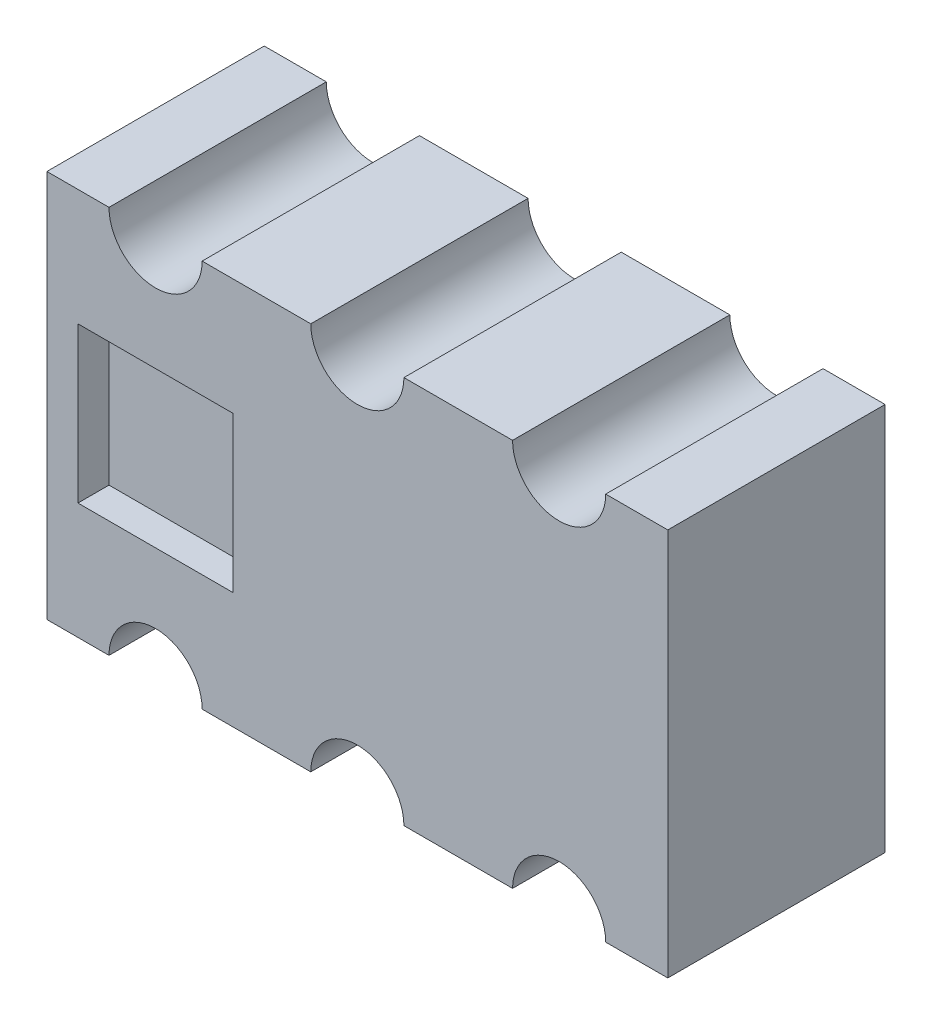
ISO-10303-21;
HEADER;
FILE_DESCRIPTION(('STEP AP214'),'2;1');
FILE_NAME('part.step','',(''),(''),'','','');
FILE_SCHEMA(('AUTOMOTIVE_DESIGN { 1 0 10303 214 1 1 1 1 }'));
ENDSEC;
DATA;
#1=APPLICATION_CONTEXT('core data for automotive mechanical design processes');
#2=APPLICATION_PROTOCOL_DEFINITION('international standard','automotive_design',2000,#1);
#3=PRODUCT_CONTEXT('',#1,'mechanical');
#4=PRODUCT('Part','Part','',(#3));
#5=PRODUCT_RELATED_PRODUCT_CATEGORY('part','',(#4));
#6=PRODUCT_DEFINITION_FORMATION('','',#4);
#7=PRODUCT_DEFINITION_CONTEXT('part definition',#1,'design');
#8=PRODUCT_DEFINITION('design','',#6,#7);
#9=PRODUCT_DEFINITION_SHAPE('','',#8);
#10=(LENGTH_UNIT() NAMED_UNIT(*) SI_UNIT(.MILLI.,.METRE.));
#11=(NAMED_UNIT(*) PLANE_ANGLE_UNIT() SI_UNIT($,.RADIAN.));
#12=(NAMED_UNIT(*) SI_UNIT($,.STERADIAN.) SOLID_ANGLE_UNIT());
#13=UNCERTAINTY_MEASURE_WITH_UNIT(LENGTH_MEASURE(1.E-05),#10,'distance_accuracy_value','');
#14=(GEOMETRIC_REPRESENTATION_CONTEXT(3) GLOBAL_UNCERTAINTY_ASSIGNED_CONTEXT((#13)) GLOBAL_UNIT_ASSIGNED_CONTEXT((#10,
#11,#12)) REPRESENTATION_CONTEXT('',''));
#15=CARTESIAN_POINT('',(0.,0.,0.));
#16=DIRECTION('',(0.,0.,1.));
#17=DIRECTION('',(1.,0.,0.));
#18=AXIS2_PLACEMENT_3D('',#15,#16,#17);
#19=CARTESIAN_POINT('',(-0.9,0.25,0.6));
#20=DIRECTION('',(0.,0.,-1.));
#21=DIRECTION('',(-1.,0.,0.));
#22=AXIS2_PLACEMENT_3D('',#19,#20,#21);
#23=PLANE('',#22);
#24=DIRECTION('',(1.,0.,0.));
#25=VECTOR('',#24,1.);
#26=CARTESIAN_POINT('',(-0.4,-0.25,0.6));
#27=LINE('',#26,#25);
#28=CARTESIAN_POINT('',(-0.4,-0.25,0.6));
#29=VERTEX_POINT('',#28);
#30=CARTESIAN_POINT('',(-0.9,-0.25,0.6));
#31=VERTEX_POINT('',#30);
#32=EDGE_CURVE('E148',#29,#31,#27,.F.);
#33=ORIENTED_EDGE('',*,*,#32,.F.);
#34=DIRECTION('',(0.,1.,0.));
#35=VECTOR('',#34,1.);
#36=CARTESIAN_POINT('',(-0.4,0.25,0.6));
#37=LINE('',#36,#35);
#38=CARTESIAN_POINT('',(-0.4,0.25,0.6));
#39=VERTEX_POINT('',#38);
#40=EDGE_CURVE('E288',#39,#29,#37,.F.);
#41=ORIENTED_EDGE('',*,*,#40,.F.);
#42=DIRECTION('',(1.,0.,0.));
#43=VECTOR('',#42,1.);
#44=CARTESIAN_POINT('',(-0.9,0.25,0.6));
#45=LINE('',#44,#43);
#46=CARTESIAN_POINT('',(-0.9,0.25,0.6));
#47=VERTEX_POINT('',#46);
#48=EDGE_CURVE('E164',#47,#39,#45,.T.);
#49=ORIENTED_EDGE('',*,*,#48,.F.);
#50=DIRECTION('',(0.,1.,0.));
#51=VECTOR('',#50,1.);
#52=CARTESIAN_POINT('',(-0.9,-0.25,0.6));
#53=LINE('',#52,#51);
#54=EDGE_CURVE('E141',#31,#47,#53,.T.);
#55=ORIENTED_EDGE('',*,*,#54,.F.);
#56=EDGE_LOOP('',(#33,#41,#49,#55));
#57=FACE_BOUND('',#56,.T.);
#58=ADVANCED_FACE('F17',(#57),#23,.F.);
#59=CARTESIAN_POINT('',(-0.4,-0.25,0.6));
#60=DIRECTION('',(0.,1.,0.));
#61=DIRECTION('',(0.,0.,1.));
#62=AXIS2_PLACEMENT_3D('',#59,#60,#61);
#63=PLANE('',#62);
#64=ORIENTED_EDGE('',*,*,#32,.T.);
#65=DIRECTION('',(0.,0.,-1.));
#66=VECTOR('',#65,1.);
#67=CARTESIAN_POINT('',(-0.9,-0.25,0.6));
#68=LINE('',#67,#66);
#69=CARTESIAN_POINT('',(-0.9,-0.25,0.7));
#70=VERTEX_POINT('',#69);
#71=EDGE_CURVE('E152',#70,#31,#68,.T.);
#72=ORIENTED_EDGE('',*,*,#71,.F.);
#73=DIRECTION('',(1.,0.,0.));
#74=VECTOR('',#73,1.);
#75=CARTESIAN_POINT('',(-1.,-0.25,0.7));
#76=LINE('',#75,#74);
#77=CARTESIAN_POINT('',(-0.4,-0.25,0.7));
#78=VERTEX_POINT('',#77);
#79=EDGE_CURVE('E252',#78,#70,#76,.F.);
#80=ORIENTED_EDGE('',*,*,#79,.F.);
#81=DIRECTION('',(0.,0.,1.));
#82=VECTOR('',#81,1.);
#83=CARTESIAN_POINT('',(-0.4,-0.25,0.6));
#84=LINE('',#83,#82);
#85=EDGE_CURVE('E155',#29,#78,#84,.T.);
#86=ORIENTED_EDGE('',*,*,#85,.F.);
#87=EDGE_LOOP('',(#64,#72,#80,#86));
#88=FACE_BOUND('',#87,.T.);
#89=ADVANCED_FACE('F149',(#88),#63,.T.);
#90=CARTESIAN_POINT('',(-0.9,-0.25,0.6));
#91=DIRECTION('',(1.,0.,0.));
#92=DIRECTION('',(0.,0.,-1.));
#93=AXIS2_PLACEMENT_3D('',#90,#91,#92);
#94=PLANE('',#93);
#95=ORIENTED_EDGE('',*,*,#54,.T.);
#96=DIRECTION('',(0.,0.,-1.));
#97=VECTOR('',#96,1.);
#98=CARTESIAN_POINT('',(-0.9,0.25,0.6));
#99=LINE('',#98,#97);
#100=CARTESIAN_POINT('',(-0.9,0.25,0.7));
#101=VERTEX_POINT('',#100);
#102=EDGE_CURVE('E165',#101,#47,#99,.T.);
#103=ORIENTED_EDGE('',*,*,#102,.F.);
#104=DIRECTION('',(0.,1.,0.));
#105=VECTOR('',#104,1.);
#106=CARTESIAN_POINT('',(-0.9,-0.625,0.7));
#107=LINE('',#106,#105);
#108=EDGE_CURVE('E161',#70,#101,#107,.T.);
#109=ORIENTED_EDGE('',*,*,#108,.F.);
#110=ORIENTED_EDGE('',*,*,#71,.T.);
#111=EDGE_LOOP('',(#95,#103,#109,#110));
#112=FACE_BOUND('',#111,.T.);
#113=ADVANCED_FACE('F159',(#112),#94,.T.);
#114=CARTESIAN_POINT('',(-0.9,0.25,0.6));
#115=DIRECTION('',(0.,-1.,0.));
#116=DIRECTION('',(0.,0.,-1.));
#117=AXIS2_PLACEMENT_3D('',#114,#115,#116);
#118=PLANE('',#117);
#119=ORIENTED_EDGE('',*,*,#48,.T.);
#120=DIRECTION('',(0.,0.,1.));
#121=VECTOR('',#120,1.);
#122=CARTESIAN_POINT('',(-0.4,0.25,0.6));
#123=LINE('',#122,#121);
#124=CARTESIAN_POINT('',(-0.4,0.25,0.7));
#125=VERTEX_POINT('',#124);
#126=EDGE_CURVE('E290',#125,#39,#123,.F.);
#127=ORIENTED_EDGE('',*,*,#126,.F.);
#128=DIRECTION('',(1.,0.,0.));
#129=VECTOR('',#128,1.);
#130=CARTESIAN_POINT('',(-1.,0.25,0.7));
#131=LINE('',#130,#129);
#132=EDGE_CURVE('E248',#101,#125,#131,.T.);
#133=ORIENTED_EDGE('',*,*,#132,.F.);
#134=ORIENTED_EDGE('',*,*,#102,.T.);
#135=EDGE_LOOP('',(#119,#127,#133,#134));
#136=FACE_BOUND('',#135,.T.);
#137=ADVANCED_FACE('F294',(#136),#118,.T.);
#138=CARTESIAN_POINT('',(-0.4,0.25,0.6));
#139=DIRECTION('',(-1.,0.,0.));
#140=DIRECTION('',(0.,0.,1.));
#141=AXIS2_PLACEMENT_3D('',#138,#139,#140);
#142=PLANE('',#141);
#143=ORIENTED_EDGE('',*,*,#40,.T.);
#144=ORIENTED_EDGE('',*,*,#85,.T.);
#145=DIRECTION('',(0.,1.,0.));
#146=VECTOR('',#145,1.);
#147=CARTESIAN_POINT('',(-0.4,-0.625,0.7));
#148=LINE('',#147,#146);
#149=EDGE_CURVE('E245',#125,#78,#148,.F.);
#150=ORIENTED_EDGE('',*,*,#149,.F.);
#151=ORIENTED_EDGE('',*,*,#126,.T.);
#152=EDGE_LOOP('',(#143,#144,#150,#151));
#153=FACE_BOUND('',#152,.T.);
#154=ADVANCED_FACE('F298',(#153),#142,.T.);
#155=CARTESIAN_POINT('',(-1.,-0.625,0.7));
#156=DIRECTION('',(0.,0.,1.));
#157=DIRECTION('',(1.,0.,0.));
#158=AXIS2_PLACEMENT_3D('',#155,#156,#157);
#159=PLANE('',#158);
#160=ORIENTED_EDGE('',*,*,#132,.T.);
#161=ORIENTED_EDGE('',*,*,#149,.T.);
#162=ORIENTED_EDGE('',*,*,#79,.T.);
#163=ORIENTED_EDGE('',*,*,#108,.T.);
#164=EDGE_LOOP('',(#160,#161,#162,#163));
#165=FACE_BOUND('',#164,.T.);
#166=DIRECTION('',(1.,0.,0.));
#167=VECTOR('',#166,1.);
#168=CARTESIAN_POINT('',(1.,0.625,0.7));
#169=LINE('',#168,#167);
#170=CARTESIAN_POINT('',(0.5,0.625,0.700000000000017));
#171=VERTEX_POINT('',#170);
#172=CARTESIAN_POINT('',(0.15,0.625,0.700000000000025));
#173=VERTEX_POINT('',#172);
#174=EDGE_CURVE('E202',#171,#173,#169,.F.);
#175=ORIENTED_EDGE('',*,*,#174,.T.);
#176=CARTESIAN_POINT('',(0.,0.625,0.700000000000034));
#177=DIRECTION('',(0.,0.,1.));
#178=DIRECTION('',(1.,0.,0.));
#179=AXIS2_PLACEMENT_3D('',#176,#177,#178);
#180=CIRCLE('',#179,0.15);
#181=CARTESIAN_POINT('',(-0.15,0.625,0.700000000000017));
#182=VERTEX_POINT('',#181);
#183=EDGE_CURVE('E195',#173,#182,#180,.F.);
#184=ORIENTED_EDGE('',*,*,#183,.T.);
#185=DIRECTION('',(1.,0.,0.));
#186=VECTOR('',#185,1.);
#187=CARTESIAN_POINT('',(1.,0.625,0.7));
#188=LINE('',#187,#186);
#189=CARTESIAN_POINT('',(-0.5,0.625,0.700000000000025));
#190=VERTEX_POINT('',#189);
#191=EDGE_CURVE('E255',#182,#190,#188,.F.);
#192=ORIENTED_EDGE('',*,*,#191,.T.);
#193=CARTESIAN_POINT('',(-0.65,0.625,0.700000000000034));
#194=DIRECTION('',(0.,0.,1.));
#195=DIRECTION('',(1.,0.,0.));
#196=AXIS2_PLACEMENT_3D('',#193,#194,#195);
#197=CIRCLE('',#196,0.15);
#198=CARTESIAN_POINT('',(-0.8,0.625,0.700000000000025));
#199=VERTEX_POINT('',#198);
#200=EDGE_CURVE('E191',#190,#199,#197,.F.);
#201=ORIENTED_EDGE('',*,*,#200,.T.);
#202=DIRECTION('',(1.,0.,0.));
#203=VECTOR('',#202,1.);
#204=CARTESIAN_POINT('',(1.,0.625,0.7));
#205=LINE('',#204,#203);
#206=CARTESIAN_POINT('',(-1.,0.625,0.7));
#207=VERTEX_POINT('',#206);
#208=EDGE_CURVE('E242',#199,#207,#205,.F.);
#209=ORIENTED_EDGE('',*,*,#208,.T.);
#210=DIRECTION('',(0.,1.,0.));
#211=VECTOR('',#210,1.);
#212=CARTESIAN_POINT('',(-1.,0.625,0.7));
#213=LINE('',#212,#211);
#214=CARTESIAN_POINT('',(-1.,-0.625,0.7));
#215=VERTEX_POINT('',#214);
#216=EDGE_CURVE('E121',#207,#215,#213,.F.);
#217=ORIENTED_EDGE('',*,*,#216,.T.);
#218=DIRECTION('',(1.,0.,0.));
#219=VECTOR('',#218,1.);
#220=CARTESIAN_POINT('',(-1.,-0.625,0.7));
#221=LINE('',#220,#219);
#222=CARTESIAN_POINT('',(-0.8,-0.625,0.700000000000025));
#223=VERTEX_POINT('',#222);
#224=EDGE_CURVE('E114',#215,#223,#221,.T.);
#225=ORIENTED_EDGE('',*,*,#224,.T.);
#226=CARTESIAN_POINT('',(-0.65,-0.625,0.700000000000034));
#227=DIRECTION('',(0.,0.,1.));
#228=DIRECTION('',(1.,0.,0.));
#229=AXIS2_PLACEMENT_3D('',#226,#227,#228);
#230=CIRCLE('',#229,0.15);
#231=CARTESIAN_POINT('',(-0.5,-0.625,0.700000000000017));
#232=VERTEX_POINT('',#231);
#233=EDGE_CURVE('E20',#223,#232,#230,.F.);
#234=ORIENTED_EDGE('',*,*,#233,.T.);
#235=DIRECTION('',(1.,0.,0.));
#236=VECTOR('',#235,1.);
#237=CARTESIAN_POINT('',(-1.,-0.625,0.7));
#238=LINE('',#237,#236);
#239=CARTESIAN_POINT('',(-0.15,-0.625,0.700000000000025));
#240=VERTEX_POINT('',#239);
#241=EDGE_CURVE('E222',#232,#240,#238,.T.);
#242=ORIENTED_EDGE('',*,*,#241,.T.);
#243=CARTESIAN_POINT('',(0.,-0.625,0.700000000000034));
#244=DIRECTION('',(0.,0.,1.));
#245=DIRECTION('',(1.,0.,0.));
#246=AXIS2_PLACEMENT_3D('',#243,#244,#245);
#247=CIRCLE('',#246,0.15);
#248=CARTESIAN_POINT('',(0.15,-0.625,0.700000000000017));
#249=VERTEX_POINT('',#248);
#250=EDGE_CURVE('E208',#240,#249,#247,.F.);
#251=ORIENTED_EDGE('',*,*,#250,.T.);
#252=DIRECTION('',(1.,0.,0.));
#253=VECTOR('',#252,1.);
#254=CARTESIAN_POINT('',(-1.,-0.625,0.7));
#255=LINE('',#254,#253);
#256=CARTESIAN_POINT('',(0.5,-0.625,0.700000000000025));
#257=VERTEX_POINT('',#256);
#258=EDGE_CURVE('E214',#249,#257,#255,.T.);
#259=ORIENTED_EDGE('',*,*,#258,.T.);
#260=CARTESIAN_POINT('',(0.65,-0.625,0.700000000000034));
#261=DIRECTION('',(0.,0.,1.));
#262=DIRECTION('',(1.,0.,0.));
#263=AXIS2_PLACEMENT_3D('',#260,#261,#262);
#264=CIRCLE('',#263,0.15);
#265=CARTESIAN_POINT('',(0.8,-0.625,0.700000000000017));
#266=VERTEX_POINT('',#265);
#267=EDGE_CURVE('E204',#257,#266,#264,.F.);
#268=ORIENTED_EDGE('',*,*,#267,.T.);
#269=DIRECTION('',(1.,0.,0.));
#270=VECTOR('',#269,1.);
#271=CARTESIAN_POINT('',(-1.,-0.625,0.7));
#272=LINE('',#271,#270);
#273=CARTESIAN_POINT('',(1.,-0.625,0.7));
#274=VERTEX_POINT('',#273);
#275=EDGE_CURVE('E206',#266,#274,#272,.T.);
#276=ORIENTED_EDGE('',*,*,#275,.T.);
#277=DIRECTION('',(0.,1.,0.));
#278=VECTOR('',#277,1.);
#279=CARTESIAN_POINT('',(1.,-0.625,0.7));
#280=LINE('',#279,#278);
#281=CARTESIAN_POINT('',(1.,0.625,0.7));
#282=VERTEX_POINT('',#281);
#283=EDGE_CURVE('E268',#274,#282,#280,.T.);
#284=ORIENTED_EDGE('',*,*,#283,.T.);
#285=DIRECTION('',(1.,0.,0.));
#286=VECTOR('',#285,1.);
#287=CARTESIAN_POINT('',(1.,0.625,0.7));
#288=LINE('',#287,#286);
#289=CARTESIAN_POINT('',(0.8,0.625,0.700000000000025));
#290=VERTEX_POINT('',#289);
#291=EDGE_CURVE('E263',#282,#290,#288,.F.);
#292=ORIENTED_EDGE('',*,*,#291,.T.);
#293=CARTESIAN_POINT('',(0.65,0.625,0.700000000000034));
#294=DIRECTION('',(0.,0.,1.));
#295=DIRECTION('',(1.,0.,0.));
#296=AXIS2_PLACEMENT_3D('',#293,#294,#295);
#297=CIRCLE('',#296,0.15);
#298=EDGE_CURVE('E199',#290,#171,#297,.F.);
#299=ORIENTED_EDGE('',*,*,#298,.T.);
#300=EDGE_LOOP('',(#175,#184,#192,#201,#209,#217,#225,#234,#242,#251,#259,#268,#276,#284,#292,#299));
#301=FACE_BOUND('',#300,.T.);
#302=ADVANCED_FACE('F302',(#165,#301),#159,.T.);
#303=CARTESIAN_POINT('',(1.,0.625,0.7));
#304=DIRECTION('',(0.,-1.,0.));
#305=DIRECTION('',(0.,0.,-1.));
#306=AXIS2_PLACEMENT_3D('',#303,#304,#305);
#307=PLANE('',#306);
#308=DIRECTION('',(1.,0.,0.));
#309=VECTOR('',#308,1.);
#310=CARTESIAN_POINT('',(-1.,0.625,0.));
#311=LINE('',#310,#309);
#312=CARTESIAN_POINT('',(-0.8,0.625,0.));
#313=VERTEX_POINT('',#312);
#314=CARTESIAN_POINT('',(-1.,0.625,0.));
#315=VERTEX_POINT('',#314);
#316=EDGE_CURVE('E194',#313,#315,#311,.F.);
#317=ORIENTED_EDGE('',*,*,#316,.T.);
#318=DIRECTION('',(0.,0.,-1.));
#319=VECTOR('',#318,1.);
#320=CARTESIAN_POINT('',(-1.,0.625,0.7));
#321=LINE('',#320,#319);
#322=EDGE_CURVE('E239',#315,#207,#321,.F.);
#323=ORIENTED_EDGE('',*,*,#322,.T.);
#324=ORIENTED_EDGE('',*,*,#208,.F.);
#325=DIRECTION('',(0.,0.,1.));
#326=VECTOR('',#325,1.);
#327=CARTESIAN_POINT('',(-0.8,0.625,-699.299999999923));
#328=LINE('',#327,#326);
#329=EDGE_CURVE('E257',#199,#313,#328,.F.);
#330=ORIENTED_EDGE('',*,*,#329,.T.);
#331=EDGE_LOOP('',(#317,#323,#324,#330));
#332=FACE_BOUND('',#331,.T.);
#333=ADVANCED_FACE('F400',(#332),#307,.F.);
#334=CARTESIAN_POINT('',(-1.,0.625,0.7));
#335=DIRECTION('',(1.,0.,0.));
#336=DIRECTION('',(0.,0.,-1.));
#337=AXIS2_PLACEMENT_3D('',#334,#335,#336);
#338=PLANE('',#337);
#339=DIRECTION('',(0.,0.,1.));
#340=VECTOR('',#339,1.);
#341=CARTESIAN_POINT('',(-1.,-0.625,0.7));
#342=LINE('',#341,#340);
#343=CARTESIAN_POINT('',(-1.,-0.625,0.));
#344=VERTEX_POINT('',#343);
#345=EDGE_CURVE('E229',#344,#215,#342,.T.);
#346=ORIENTED_EDGE('',*,*,#345,.T.);
#347=ORIENTED_EDGE('',*,*,#216,.F.);
#348=ORIENTED_EDGE('',*,*,#322,.F.);
#349=DIRECTION('',(0.,1.,0.));
#350=VECTOR('',#349,1.);
#351=CARTESIAN_POINT('',(-1.,-0.625,0.));
#352=LINE('',#351,#350);
#353=EDGE_CURVE('E234',#315,#344,#352,.F.);
#354=ORIENTED_EDGE('',*,*,#353,.T.);
#355=EDGE_LOOP('',(#346,#347,#348,#354));
#356=FACE_BOUND('',#355,.T.);
#357=ADVANCED_FACE('F402',(#356),#338,.F.);
#358=CARTESIAN_POINT('',(-1.,-0.625,0.7));
#359=DIRECTION('',(0.,1.,0.));
#360=DIRECTION('',(0.,0.,1.));
#361=AXIS2_PLACEMENT_3D('',#358,#359,#360);
#362=PLANE('',#361);
#363=DIRECTION('',(0.,0.,1.));
#364=VECTOR('',#363,1.);
#365=CARTESIAN_POINT('',(-0.8,-0.625,-699.299999999923));
#366=LINE('',#365,#364);
#367=CARTESIAN_POINT('',(-0.8,-0.625,0.));
#368=VERTEX_POINT('',#367);
#369=EDGE_CURVE('E226',#368,#223,#366,.T.);
#370=ORIENTED_EDGE('',*,*,#369,.T.);
#371=ORIENTED_EDGE('',*,*,#224,.F.);
#372=ORIENTED_EDGE('',*,*,#345,.F.);
#373=DIRECTION('',(1.,0.,0.));
#374=VECTOR('',#373,1.);
#375=CARTESIAN_POINT('',(-1.,-0.625,0.));
#376=LINE('',#375,#374);
#377=EDGE_CURVE('E190',#344,#368,#376,.T.);
#378=ORIENTED_EDGE('',*,*,#377,.T.);
#379=EDGE_LOOP('',(#370,#371,#372,#378));
#380=FACE_BOUND('',#379,.T.);
#381=ADVANCED_FACE('F407',(#380),#362,.F.);
#382=CARTESIAN_POINT('',(-0.65,-0.625,-699.299999999923));
#383=DIRECTION('',(0.,0.,1.));
#384=DIRECTION('',(1.,0.,0.));
#385=AXIS2_PLACEMENT_3D('',#382,#383,#384);
#386=CYLINDRICAL_SURFACE('',#385,0.15);
#387=ORIENTED_EDGE('',*,*,#369,.F.);
#388=CARTESIAN_POINT('',(-0.65,-0.625,0.));
#389=DIRECTION('',(0.,0.,1.));
#390=DIRECTION('',(1.,0.,0.));
#391=AXIS2_PLACEMENT_3D('',#388,#389,#390);
#392=CIRCLE('',#391,0.15);
#393=CARTESIAN_POINT('',(-0.5,-0.625,0.));
#394=VERTEX_POINT('',#393);
#395=EDGE_CURVE('E187',#368,#394,#392,.F.);
#396=ORIENTED_EDGE('',*,*,#395,.T.);
#397=DIRECTION('',(0.,0.,1.));
#398=VECTOR('',#397,1.);
#399=CARTESIAN_POINT('',(-0.5,-0.625,0.7));
#400=LINE('',#399,#398);
#401=EDGE_CURVE('E217',#394,#232,#400,.T.);
#402=ORIENTED_EDGE('',*,*,#401,.T.);
#403=ORIENTED_EDGE('',*,*,#233,.F.);
#404=EDGE_LOOP('',(#387,#396,#402,#403));
#405=FACE_BOUND('',#404,.T.);
#406=ADVANCED_FACE('F411',(#405),#386,.F.);
#407=CARTESIAN_POINT('',(-1.,-0.625,0.7));
#408=DIRECTION('',(0.,1.,0.));
#409=DIRECTION('',(0.,0.,1.));
#410=AXIS2_PLACEMENT_3D('',#407,#408,#409);
#411=PLANE('',#410);
#412=DIRECTION('',(1.,0.,0.));
#413=VECTOR('',#412,1.);
#414=CARTESIAN_POINT('',(-1.,-0.625,0.));
#415=LINE('',#414,#413);
#416=CARTESIAN_POINT('',(-0.15,-0.625,0.));
#417=VERTEX_POINT('',#416);
#418=EDGE_CURVE('E186',#394,#417,#415,.T.);
#419=ORIENTED_EDGE('',*,*,#418,.T.);
#420=DIRECTION('',(0.,0.,1.));
#421=VECTOR('',#420,1.);
#422=CARTESIAN_POINT('',(-0.15,-0.625,-699.299999999923));
#423=LINE('',#422,#421);
#424=EDGE_CURVE('E210',#417,#240,#423,.T.);
#425=ORIENTED_EDGE('',*,*,#424,.T.);
#426=ORIENTED_EDGE('',*,*,#241,.F.);
#427=ORIENTED_EDGE('',*,*,#401,.F.);
#428=EDGE_LOOP('',(#419,#425,#426,#427));
#429=FACE_BOUND('',#428,.T.);
#430=ADVANCED_FACE('F414',(#429),#411,.F.);
#431=CARTESIAN_POINT('',(0.,-0.625,-699.299999999923));
#432=DIRECTION('',(0.,0.,1.));
#433=DIRECTION('',(1.,0.,0.));
#434=AXIS2_PLACEMENT_3D('',#431,#432,#433);
#435=CYLINDRICAL_SURFACE('',#434,0.15);
#436=ORIENTED_EDGE('',*,*,#424,.F.);
#437=CARTESIAN_POINT('',(0.,-0.625,0.));
#438=DIRECTION('',(0.,0.,1.));
#439=DIRECTION('',(1.,0.,0.));
#440=AXIS2_PLACEMENT_3D('',#437,#438,#439);
#441=CIRCLE('',#440,0.15);
#442=CARTESIAN_POINT('',(0.15,-0.625,0.));
#443=VERTEX_POINT('',#442);
#444=EDGE_CURVE('E183',#417,#443,#441,.F.);
#445=ORIENTED_EDGE('',*,*,#444,.T.);
#446=DIRECTION('',(0.,0.,1.));
#447=VECTOR('',#446,1.);
#448=CARTESIAN_POINT('',(0.15,-0.625,0.7));
#449=LINE('',#448,#447);
#450=EDGE_CURVE('E209',#443,#249,#449,.T.);
#451=ORIENTED_EDGE('',*,*,#450,.T.);
#452=ORIENTED_EDGE('',*,*,#250,.F.);
#453=EDGE_LOOP('',(#436,#445,#451,#452));
#454=FACE_BOUND('',#453,.T.);
#455=ADVANCED_FACE('F413',(#454),#435,.F.);
#456=CARTESIAN_POINT('',(-1.,-0.625,0.7));
#457=DIRECTION('',(0.,1.,0.));
#458=DIRECTION('',(0.,0.,1.));
#459=AXIS2_PLACEMENT_3D('',#456,#457,#458);
#460=PLANE('',#459);
#461=DIRECTION('',(0.,0.,1.));
#462=VECTOR('',#461,1.);
#463=CARTESIAN_POINT('',(0.5,-0.625,-699.299999999923));
#464=LINE('',#463,#462);
#465=CARTESIAN_POINT('',(0.5,-0.625,0.));
#466=VERTEX_POINT('',#465);
#467=EDGE_CURVE('E207',#466,#257,#464,.T.);
#468=ORIENTED_EDGE('',*,*,#467,.T.);
#469=ORIENTED_EDGE('',*,*,#258,.F.);
#470=ORIENTED_EDGE('',*,*,#450,.F.);
#471=DIRECTION('',(1.,0.,0.));
#472=VECTOR('',#471,1.);
#473=CARTESIAN_POINT('',(-1.,-0.625,0.));
#474=LINE('',#473,#472);
#475=EDGE_CURVE('E182',#443,#466,#474,.T.);
#476=ORIENTED_EDGE('',*,*,#475,.T.);
#477=EDGE_LOOP('',(#468,#469,#470,#476));
#478=FACE_BOUND('',#477,.T.);
#479=ADVANCED_FACE('F335',(#478),#460,.F.);
#480=CARTESIAN_POINT('',(0.65,-0.625,-699.299999999923));
#481=DIRECTION('',(0.,0.,1.));
#482=DIRECTION('',(1.,0.,0.));
#483=AXIS2_PLACEMENT_3D('',#480,#481,#482);
#484=CYLINDRICAL_SURFACE('',#483,0.15);
#485=ORIENTED_EDGE('',*,*,#467,.F.);
#486=CARTESIAN_POINT('',(0.65,-0.625,0.));
#487=DIRECTION('',(0.,0.,1.));
#488=DIRECTION('',(1.,0.,0.));
#489=AXIS2_PLACEMENT_3D('',#486,#487,#488);
#490=CIRCLE('',#489,0.15);
#491=CARTESIAN_POINT('',(0.8,-0.625,0.));
#492=VERTEX_POINT('',#491);
#493=EDGE_CURVE('E178',#466,#492,#490,.F.);
#494=ORIENTED_EDGE('',*,*,#493,.T.);
#495=DIRECTION('',(0.,0.,1.));
#496=VECTOR('',#495,1.);
#497=CARTESIAN_POINT('',(0.8,-0.625,0.7));
#498=LINE('',#497,#496);
#499=EDGE_CURVE('E276',#492,#266,#498,.T.);
#500=ORIENTED_EDGE('',*,*,#499,.T.);
#501=ORIENTED_EDGE('',*,*,#267,.F.);
#502=EDGE_LOOP('',(#485,#494,#500,#501));
#503=FACE_BOUND('',#502,.T.);
#504=ADVANCED_FACE('F339',(#503),#484,.F.);
#505=CARTESIAN_POINT('',(-1.,-0.625,0.7));
#506=DIRECTION('',(0.,1.,0.));
#507=DIRECTION('',(0.,0.,1.));
#508=AXIS2_PLACEMENT_3D('',#505,#506,#507);
#509=PLANE('',#508);
#510=DIRECTION('',(1.,0.,0.));
#511=VECTOR('',#510,1.);
#512=CARTESIAN_POINT('',(-1.,-0.625,0.));
#513=LINE('',#512,#511);
#514=CARTESIAN_POINT('',(1.,-0.625,0.));
#515=VERTEX_POINT('',#514);
#516=EDGE_CURVE('E181',#492,#515,#513,.T.);
#517=ORIENTED_EDGE('',*,*,#516,.T.);
#518=DIRECTION('',(0.,0.,1.));
#519=VECTOR('',#518,1.);
#520=CARTESIAN_POINT('',(1.,-0.625,0.7));
#521=LINE('',#520,#519);
#522=EDGE_CURVE('E271',#515,#274,#521,.T.);
#523=ORIENTED_EDGE('',*,*,#522,.T.);
#524=ORIENTED_EDGE('',*,*,#275,.F.);
#525=ORIENTED_EDGE('',*,*,#499,.F.);
#526=EDGE_LOOP('',(#517,#523,#524,#525));
#527=FACE_BOUND('',#526,.T.);
#528=ADVANCED_FACE('F323',(#527),#509,.F.);
#529=CARTESIAN_POINT('',(1.,-0.625,0.7));
#530=DIRECTION('',(-1.,0.,0.));
#531=DIRECTION('',(0.,0.,1.));
#532=AXIS2_PLACEMENT_3D('',#529,#530,#531);
#533=PLANE('',#532);
#534=DIRECTION('',(0.,0.,-1.));
#535=VECTOR('',#534,1.);
#536=CARTESIAN_POINT('',(1.,0.625,0.7));
#537=LINE('',#536,#535);
#538=CARTESIAN_POINT('',(1.,0.625,0.));
#539=VERTEX_POINT('',#538);
#540=EDGE_CURVE('E265',#539,#282,#537,.F.);
#541=ORIENTED_EDGE('',*,*,#540,.T.);
#542=ORIENTED_EDGE('',*,*,#283,.F.);
#543=ORIENTED_EDGE('',*,*,#522,.F.);
#544=DIRECTION('',(0.,1.,0.));
#545=VECTOR('',#544,1.);
#546=CARTESIAN_POINT('',(1.,-0.625,0.));
#547=LINE('',#546,#545);
#548=EDGE_CURVE('E345',#515,#539,#547,.T.);
#549=ORIENTED_EDGE('',*,*,#548,.T.);
#550=EDGE_LOOP('',(#541,#542,#543,#549));
#551=FACE_BOUND('',#550,.T.);
#552=ADVANCED_FACE('F319',(#551),#533,.F.);
#553=CARTESIAN_POINT('',(1.,0.625,0.7));
#554=DIRECTION('',(0.,-1.,0.));
#555=DIRECTION('',(0.,0.,-1.));
#556=AXIS2_PLACEMENT_3D('',#553,#554,#555);
#557=PLANE('',#556);
#558=DIRECTION('',(0.,0.,1.));
#559=VECTOR('',#558,1.);
#560=CARTESIAN_POINT('',(0.8,0.625,-699.299999999923));
#561=LINE('',#560,#559);
#562=CARTESIAN_POINT('',(0.8,0.625,0.));
#563=VERTEX_POINT('',#562);
#564=EDGE_CURVE('E203',#563,#290,#561,.T.);
#565=ORIENTED_EDGE('',*,*,#564,.T.);
#566=ORIENTED_EDGE('',*,*,#291,.F.);
#567=ORIENTED_EDGE('',*,*,#540,.F.);
#568=DIRECTION('',(1.,0.,0.));
#569=VECTOR('',#568,1.);
#570=CARTESIAN_POINT('',(-1.,0.625,0.));
#571=LINE('',#570,#569);
#572=EDGE_CURVE('E177',#539,#563,#571,.F.);
#573=ORIENTED_EDGE('',*,*,#572,.T.);
#574=EDGE_LOOP('',(#565,#566,#567,#573));
#575=FACE_BOUND('',#574,.T.);
#576=ADVANCED_FACE('F378',(#575),#557,.F.);
#577=CARTESIAN_POINT('',(0.65,0.625,-699.299999999923));
#578=DIRECTION('',(0.,0.,1.));
#579=DIRECTION('',(1.,0.,0.));
#580=AXIS2_PLACEMENT_3D('',#577,#578,#579);
#581=CYLINDRICAL_SURFACE('',#580,0.15);
#582=ORIENTED_EDGE('',*,*,#564,.F.);
#583=CARTESIAN_POINT('',(0.65,0.625,0.));
#584=DIRECTION('',(0.,0.,1.));
#585=DIRECTION('',(1.,0.,0.));
#586=AXIS2_PLACEMENT_3D('',#583,#584,#585);
#587=CIRCLE('',#586,0.15);
#588=CARTESIAN_POINT('',(0.5,0.625,0.));
#589=VERTEX_POINT('',#588);
#590=EDGE_CURVE('E174',#563,#589,#587,.F.);
#591=ORIENTED_EDGE('',*,*,#590,.T.);
#592=DIRECTION('',(0.,0.,-1.));
#593=VECTOR('',#592,1.);
#594=CARTESIAN_POINT('',(0.5,0.625,0.7));
#595=LINE('',#594,#593);
#596=EDGE_CURVE('E262',#589,#171,#595,.F.);
#597=ORIENTED_EDGE('',*,*,#596,.T.);
#598=ORIENTED_EDGE('',*,*,#298,.F.);
#599=EDGE_LOOP('',(#582,#591,#597,#598));
#600=FACE_BOUND('',#599,.T.);
#601=ADVANCED_FACE('F382',(#600),#581,.F.);
#602=CARTESIAN_POINT('',(1.,0.625,0.7));
#603=DIRECTION('',(0.,-1.,0.));
#604=DIRECTION('',(0.,0.,-1.));
#605=AXIS2_PLACEMENT_3D('',#602,#603,#604);
#606=PLANE('',#605);
#607=DIRECTION('',(1.,0.,0.));
#608=VECTOR('',#607,1.);
#609=CARTESIAN_POINT('',(-1.,0.625,0.));
#610=LINE('',#609,#608);
#611=CARTESIAN_POINT('',(0.15,0.625,0.));
#612=VERTEX_POINT('',#611);
#613=EDGE_CURVE('E173',#589,#612,#610,.F.);
#614=ORIENTED_EDGE('',*,*,#613,.T.);
#615=DIRECTION('',(0.,0.,1.));
#616=VECTOR('',#615,1.);
#617=CARTESIAN_POINT('',(0.15,0.625,-699.299999999923));
#618=LINE('',#617,#616);
#619=EDGE_CURVE('E198',#612,#173,#618,.T.);
#620=ORIENTED_EDGE('',*,*,#619,.T.);
#621=ORIENTED_EDGE('',*,*,#174,.F.);
#622=ORIENTED_EDGE('',*,*,#596,.F.);
#623=EDGE_LOOP('',(#614,#620,#621,#622));
#624=FACE_BOUND('',#623,.T.);
#625=ADVANCED_FACE('F396',(#624),#606,.F.);
#626=CARTESIAN_POINT('',(0.,0.625,-699.299999999923));
#627=DIRECTION('',(0.,0.,1.));
#628=DIRECTION('',(1.,0.,0.));
#629=AXIS2_PLACEMENT_3D('',#626,#627,#628);
#630=CYLINDRICAL_SURFACE('',#629,0.15);
#631=ORIENTED_EDGE('',*,*,#619,.F.);
#632=CARTESIAN_POINT('',(0.,0.625,0.));
#633=DIRECTION('',(0.,0.,1.));
#634=DIRECTION('',(1.,0.,0.));
#635=AXIS2_PLACEMENT_3D('',#632,#633,#634);
#636=CIRCLE('',#635,0.15);
#637=CARTESIAN_POINT('',(-0.15,0.625,0.));
#638=VERTEX_POINT('',#637);
#639=EDGE_CURVE('E170',#612,#638,#636,.F.);
#640=ORIENTED_EDGE('',*,*,#639,.T.);
#641=DIRECTION('',(0.,0.,-1.));
#642=VECTOR('',#641,1.);
#643=CARTESIAN_POINT('',(-0.15,0.625,0.7));
#644=LINE('',#643,#642);
#645=EDGE_CURVE('E197',#638,#182,#644,.F.);
#646=ORIENTED_EDGE('',*,*,#645,.T.);
#647=ORIENTED_EDGE('',*,*,#183,.F.);
#648=EDGE_LOOP('',(#631,#640,#646,#647));
#649=FACE_BOUND('',#648,.T.);
#650=ADVANCED_FACE('F394',(#649),#630,.F.);
#651=CARTESIAN_POINT('',(1.,0.625,0.7));
#652=DIRECTION('',(0.,-1.,0.));
#653=DIRECTION('',(0.,0.,-1.));
#654=AXIS2_PLACEMENT_3D('',#651,#652,#653);
#655=PLANE('',#654);
#656=DIRECTION('',(0.,0.,1.));
#657=VECTOR('',#656,1.);
#658=CARTESIAN_POINT('',(-0.5,0.625,-699.299999999923));
#659=LINE('',#658,#657);
#660=CARTESIAN_POINT('',(-0.5,0.625,0.));
#661=VERTEX_POINT('',#660);
#662=EDGE_CURVE('E34',#661,#190,#659,.T.);
#663=ORIENTED_EDGE('',*,*,#662,.T.);
#664=ORIENTED_EDGE('',*,*,#191,.F.);
#665=ORIENTED_EDGE('',*,*,#645,.F.);
#666=DIRECTION('',(1.,0.,0.));
#667=VECTOR('',#666,1.);
#668=CARTESIAN_POINT('',(-1.,0.625,0.));
#669=LINE('',#668,#667);
#670=EDGE_CURVE('E26',#638,#661,#669,.F.);
#671=ORIENTED_EDGE('',*,*,#670,.T.);
#672=EDGE_LOOP('',(#663,#664,#665,#671));
#673=FACE_BOUND('',#672,.T.);
#674=ADVANCED_FACE('F391',(#673),#655,.F.);
#675=CARTESIAN_POINT('',(-0.65,0.625,-699.299999999923));
#676=DIRECTION('',(0.,0.,1.));
#677=DIRECTION('',(1.,0.,0.));
#678=AXIS2_PLACEMENT_3D('',#675,#676,#677);
#679=CYLINDRICAL_SURFACE('',#678,0.15);
#680=ORIENTED_EDGE('',*,*,#662,.F.);
#681=CARTESIAN_POINT('',(-0.65,0.625,0.));
#682=DIRECTION('',(0.,0.,1.));
#683=DIRECTION('',(1.,0.,0.));
#684=AXIS2_PLACEMENT_3D('',#681,#682,#683);
#685=CIRCLE('',#684,0.15);
#686=EDGE_CURVE('E11',#661,#313,#685,.F.);
#687=ORIENTED_EDGE('',*,*,#686,.T.);
#688=ORIENTED_EDGE('',*,*,#329,.F.);
#689=ORIENTED_EDGE('',*,*,#200,.F.);
#690=EDGE_LOOP('',(#680,#687,#688,#689));
#691=FACE_BOUND('',#690,.T.);
#692=ADVANCED_FACE('F398',(#691),#679,.F.);
#693=CARTESIAN_POINT('',(-1.,-0.625,0.));
#694=DIRECTION('',(0.,0.,1.));
#695=DIRECTION('',(1.,0.,0.));
#696=AXIS2_PLACEMENT_3D('',#693,#694,#695);
#697=PLANE('',#696);
#698=ORIENTED_EDGE('',*,*,#670,.F.);
#699=ORIENTED_EDGE('',*,*,#639,.F.);
#700=ORIENTED_EDGE('',*,*,#613,.F.);
#701=ORIENTED_EDGE('',*,*,#590,.F.);
#702=ORIENTED_EDGE('',*,*,#572,.F.);
#703=ORIENTED_EDGE('',*,*,#548,.F.);
#704=ORIENTED_EDGE('',*,*,#516,.F.);
#705=ORIENTED_EDGE('',*,*,#493,.F.);
#706=ORIENTED_EDGE('',*,*,#475,.F.);
#707=ORIENTED_EDGE('',*,*,#444,.F.);
#708=ORIENTED_EDGE('',*,*,#418,.F.);
#709=ORIENTED_EDGE('',*,*,#395,.F.);
#710=ORIENTED_EDGE('',*,*,#377,.F.);
#711=ORIENTED_EDGE('',*,*,#353,.F.);
#712=ORIENTED_EDGE('',*,*,#316,.F.);
#713=ORIENTED_EDGE('',*,*,#686,.F.);
#714=EDGE_LOOP('',(#698,#699,#700,#701,#702,#703,#704,#705,#706,#707,#708,#709,#710,#711,#712,#713));
#715=FACE_BOUND('',#714,.T.);
#716=ADVANCED_FACE('F342',(#715),#697,.F.);
#717=CLOSED_SHELL('',(#58,#89,#113,#137,#154,#302,#333,#357,#381,#406,#430,#455,#479,#504,#528,
#552,#576,#601,#625,#650,#674,#692,#716));
#718=MANIFOLD_SOLID_BREP('B1',#717);
#719=ADVANCED_BREP_SHAPE_REPRESENTATION('',(#18,#718),#14);
#720=SHAPE_DEFINITION_REPRESENTATION(#9,#719);
ENDSEC;
END-ISO-10303-21;
